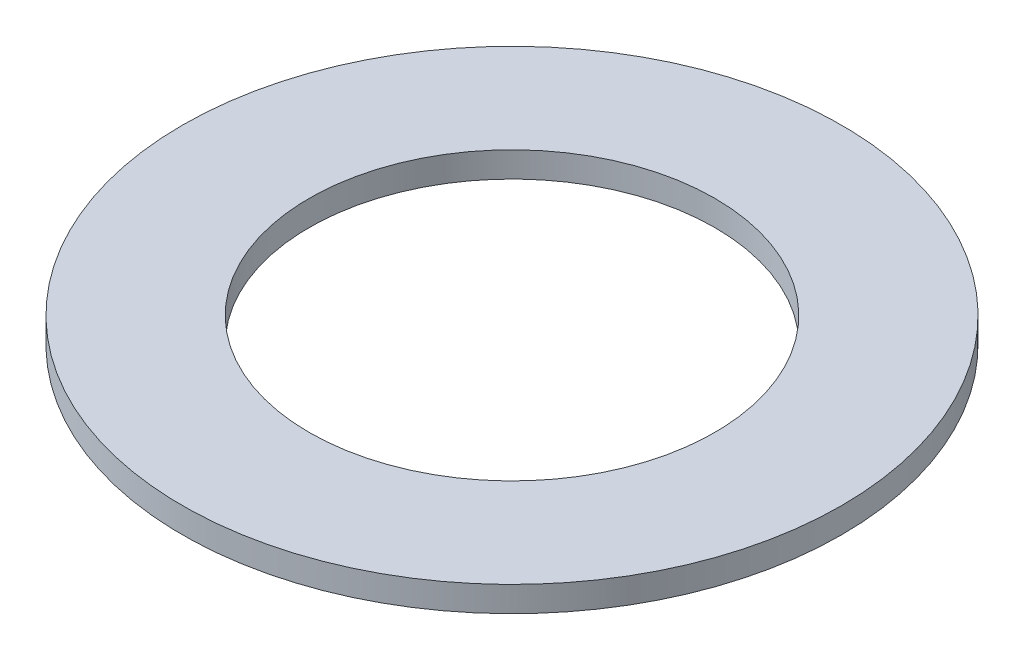
ISO-10303-21;
HEADER;
FILE_DESCRIPTION(('STEP AP214'),'2;1');
FILE_NAME('part.step','',(''),(''),'','','');
FILE_SCHEMA(('AUTOMOTIVE_DESIGN { 1 0 10303 214 1 1 1 1 }'));
ENDSEC;
DATA;
#1=APPLICATION_CONTEXT('core data for automotive mechanical design processes');
#2=APPLICATION_PROTOCOL_DEFINITION('international standard','automotive_design',2000,#1);
#3=PRODUCT_CONTEXT('',#1,'mechanical');
#4=PRODUCT('Part','Part','',(#3));
#5=PRODUCT_RELATED_PRODUCT_CATEGORY('part','',(#4));
#6=PRODUCT_DEFINITION_FORMATION('','',#4);
#7=PRODUCT_DEFINITION_CONTEXT('part definition',#1,'design');
#8=PRODUCT_DEFINITION('design','',#6,#7);
#9=PRODUCT_DEFINITION_SHAPE('','',#8);
#10=(LENGTH_UNIT() NAMED_UNIT(*) SI_UNIT(.MILLI.,.METRE.));
#11=(NAMED_UNIT(*) PLANE_ANGLE_UNIT() SI_UNIT($,.RADIAN.));
#12=(NAMED_UNIT(*) SI_UNIT($,.STERADIAN.) SOLID_ANGLE_UNIT());
#13=UNCERTAINTY_MEASURE_WITH_UNIT(LENGTH_MEASURE(1.E-05),#10,'distance_accuracy_value','');
#14=(GEOMETRIC_REPRESENTATION_CONTEXT(3) GLOBAL_UNCERTAINTY_ASSIGNED_CONTEXT((#13)) GLOBAL_UNIT_ASSIGNED_CONTEXT((#10,
#11,#12)) REPRESENTATION_CONTEXT('',''));
#15=CARTESIAN_POINT('',(0.,0.,0.));
#16=DIRECTION('',(0.,0.,1.));
#17=DIRECTION('',(1.,0.,0.));
#18=AXIS2_PLACEMENT_3D('',#15,#16,#17);
#19=CARTESIAN_POINT('',(0.,1.,0.));
#20=DIRECTION('',(0.,1.,0.));
#21=DIRECTION('',(0.,0.,1.));
#22=AXIS2_PLACEMENT_3D('',#19,#20,#21);
#23=PLANE('',#22);
#24=CARTESIAN_POINT('',(0.,1.,0.));
#25=DIRECTION('',(0.,1.,0.));
#26=DIRECTION('',(1.,0.,0.));
#27=AXIS2_PLACEMENT_3D('',#24,#25,#26);
#28=CIRCLE('',#27,13.);
#29=CARTESIAN_POINT('',(13.,1.,0.));
#30=VERTEX_POINT('',#29);
#31=EDGE_CURVE('E11',#30,#30,#28,.T.);
#32=ORIENTED_EDGE('',*,*,#31,.T.);
#33=EDGE_LOOP('',(#32));
#34=FACE_BOUND('',#33,.T.);
#35=CARTESIAN_POINT('',(0.,1.,0.));
#36=DIRECTION('',(0.,1.,0.));
#37=DIRECTION('',(0.,0.,1.));
#38=AXIS2_PLACEMENT_3D('',#35,#36,#37);
#39=CIRCLE('',#38,8.);
#40=CARTESIAN_POINT('',(0.,1.,8.));
#41=VERTEX_POINT('',#40);
#42=EDGE_CURVE('E49',#41,#41,#39,.T.);
#43=ORIENTED_EDGE('',*,*,#42,.F.);
#44=EDGE_LOOP('',(#43));
#45=FACE_BOUND('',#44,.T.);
#46=ADVANCED_FACE('F38',(#34,#45),#23,.T.);
#47=CARTESIAN_POINT('',(0.,0.,0.));
#48=DIRECTION('',(0.,1.,0.));
#49=DIRECTION('',(0.,0.,1.));
#50=AXIS2_PLACEMENT_3D('',#47,#48,#49);
#51=PLANE('',#50);
#52=CARTESIAN_POINT('',(0.,0.,0.));
#53=DIRECTION('',(0.,1.,0.));
#54=DIRECTION('',(1.,0.,0.));
#55=AXIS2_PLACEMENT_3D('',#52,#53,#54);
#56=CIRCLE('',#55,13.);
#57=CARTESIAN_POINT('',(13.,0.,0.));
#58=VERTEX_POINT('',#57);
#59=EDGE_CURVE('E42',#58,#58,#56,.T.);
#60=ORIENTED_EDGE('',*,*,#59,.F.);
#61=EDGE_LOOP('',(#60));
#62=FACE_BOUND('',#61,.T.);
#63=CARTESIAN_POINT('',(0.,0.,0.));
#64=DIRECTION('',(0.,1.,0.));
#65=DIRECTION('',(0.,0.,1.));
#66=AXIS2_PLACEMENT_3D('',#63,#64,#65);
#67=CIRCLE('',#66,8.);
#68=CARTESIAN_POINT('',(0.,0.,8.));
#69=VERTEX_POINT('',#68);
#70=EDGE_CURVE('E51',#69,#69,#67,.T.);
#71=ORIENTED_EDGE('',*,*,#70,.T.);
#72=EDGE_LOOP('',(#71));
#73=FACE_BOUND('',#72,.T.);
#74=ADVANCED_FACE('F61',(#62,#73),#51,.F.);
#75=CARTESIAN_POINT('',(0.,1.,0.));
#76=DIRECTION('',(0.,-1.,0.));
#77=DIRECTION('',(0.,0.,-1.));
#78=AXIS2_PLACEMENT_3D('',#75,#76,#77);
#79=CYLINDRICAL_SURFACE('',#78,13.);
#80=ORIENTED_EDGE('',*,*,#31,.F.);
#81=EDGE_LOOP('',(#80));
#82=FACE_BOUND('',#81,.T.);
#83=ORIENTED_EDGE('',*,*,#59,.T.);
#84=EDGE_LOOP('',(#83));
#85=FACE_BOUND('',#84,.T.);
#86=ADVANCED_FACE('F40',(#82,#85),#79,.T.);
#87=CARTESIAN_POINT('',(0.,1.,0.));
#88=DIRECTION('',(0.,-1.,0.));
#89=DIRECTION('',(0.,0.,-1.));
#90=AXIS2_PLACEMENT_3D('',#87,#88,#89);
#91=CYLINDRICAL_SURFACE('',#90,8.);
#92=ORIENTED_EDGE('',*,*,#42,.T.);
#93=EDGE_LOOP('',(#92));
#94=FACE_BOUND('',#93,.T.);
#95=ORIENTED_EDGE('',*,*,#70,.F.);
#96=EDGE_LOOP('',(#95));
#97=FACE_BOUND('',#96,.T.);
#98=ADVANCED_FACE('F57',(#94,#97),#91,.F.);
#99=CLOSED_SHELL('',(#46,#74,#86,#98));
#100=MANIFOLD_SOLID_BREP('B2',#99);
#101=ADVANCED_BREP_SHAPE_REPRESENTATION('',(#18,#100),#14);
#102=SHAPE_DEFINITION_REPRESENTATION(#9,#101);
ENDSEC;
END-ISO-10303-21;
